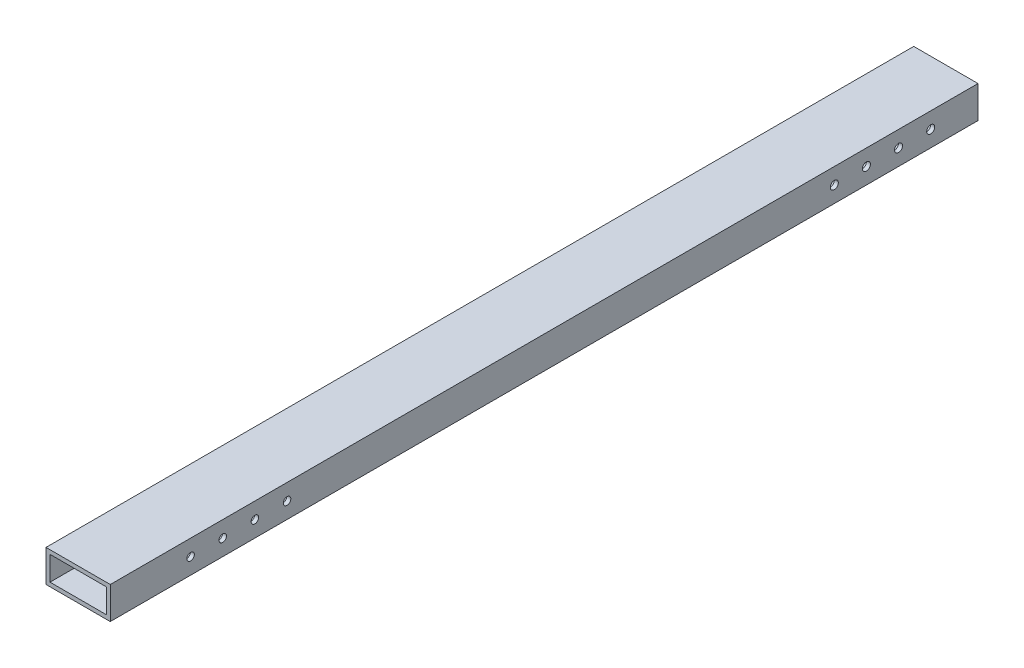
ISO-10303-21;
HEADER;
FILE_DESCRIPTION(('STEP AP214'),'2;1');
FILE_NAME('part.step','',(''),(''),'','','');
FILE_SCHEMA(('AUTOMOTIVE_DESIGN { 1 0 10303 214 1 1 1 1 }'));
ENDSEC;
DATA;
#1=APPLICATION_CONTEXT('core data for automotive mechanical design processes');
#2=APPLICATION_PROTOCOL_DEFINITION('international standard','automotive_design',2000,#1);
#3=PRODUCT_CONTEXT('',#1,'mechanical');
#4=PRODUCT('Part','Part','',(#3));
#5=PRODUCT_RELATED_PRODUCT_CATEGORY('part','',(#4));
#6=PRODUCT_DEFINITION_FORMATION('','',#4);
#7=PRODUCT_DEFINITION_CONTEXT('part definition',#1,'design');
#8=PRODUCT_DEFINITION('design','',#6,#7);
#9=PRODUCT_DEFINITION_SHAPE('','',#8);
#10=(LENGTH_UNIT() NAMED_UNIT(*) SI_UNIT(.MILLI.,.METRE.));
#11=(NAMED_UNIT(*) PLANE_ANGLE_UNIT() SI_UNIT($,.RADIAN.));
#12=(NAMED_UNIT(*) SI_UNIT($,.STERADIAN.) SOLID_ANGLE_UNIT());
#13=UNCERTAINTY_MEASURE_WITH_UNIT(LENGTH_MEASURE(1.E-05),#10,'distance_accuracy_value','');
#14=(GEOMETRIC_REPRESENTATION_CONTEXT(3) GLOBAL_UNCERTAINTY_ASSIGNED_CONTEXT((#13)) GLOBAL_UNIT_ASSIGNED_CONTEXT((#10,
#11,#12)) REPRESENTATION_CONTEXT('',''));
#15=CARTESIAN_POINT('',(0.,0.,0.));
#16=DIRECTION('',(0.,0.,1.));
#17=DIRECTION('',(1.,0.,0.));
#18=AXIS2_PLACEMENT_3D('',#15,#16,#17);
#19=CARTESIAN_POINT('',(25.4,-12.7,342.9));
#20=DIRECTION('',(-1.,0.,0.));
#21=DIRECTION('',(0.,0.,1.));
#22=AXIS2_PLACEMENT_3D('',#19,#20,#21);
#23=PLANE('',#22);
#24=CARTESIAN_POINT('',(25.4,0.,-305.51179998754));
#25=DIRECTION('',(1.,0.,0.));
#26=DIRECTION('',(0.,0.,-1.));
#27=AXIS2_PLACEMENT_3D('',#24,#25,#26);
#28=CIRCLE('',#27,3.17499999999999);
#29=CARTESIAN_POINT('',(25.4,0.,-308.68679998754));
#30=VERTEX_POINT('',#29);
#31=EDGE_CURVE('E392',#30,#30,#28,.T.);
#32=ORIENTED_EDGE('',*,*,#31,.F.);
#33=EDGE_LOOP('',(#32));
#34=FACE_BOUND('',#33,.T.);
#35=CARTESIAN_POINT('',(25.4,0.,-280.111799987541));
#36=DIRECTION('',(1.,0.,0.));
#37=DIRECTION('',(0.,0.,-1.));
#38=AXIS2_PLACEMENT_3D('',#35,#36,#37);
#39=CIRCLE('',#38,3.17499999999999);
#40=CARTESIAN_POINT('',(25.4,0.,-283.28679998754));
#41=VERTEX_POINT('',#40);
#42=EDGE_CURVE('E205',#41,#41,#39,.T.);
#43=ORIENTED_EDGE('',*,*,#42,.F.);
#44=EDGE_LOOP('',(#43));
#45=FACE_BOUND('',#44,.T.);
#46=CARTESIAN_POINT('',(25.4,0.,-254.711799987541));
#47=DIRECTION('',(1.,0.,0.));
#48=DIRECTION('',(0.,0.,-1.));
#49=AXIS2_PLACEMENT_3D('',#46,#47,#48);
#50=CIRCLE('',#49,3.17499999999999);
#51=CARTESIAN_POINT('',(25.4,0.,-257.88679998754));
#52=VERTEX_POINT('',#51);
#53=EDGE_CURVE('E202',#52,#52,#50,.T.);
#54=ORIENTED_EDGE('',*,*,#53,.F.);
#55=EDGE_LOOP('',(#54));
#56=FACE_BOUND('',#55,.T.);
#57=CARTESIAN_POINT('',(25.4,0.,-229.311799987541));
#58=DIRECTION('',(1.,0.,0.));
#59=DIRECTION('',(0.,0.,-1.));
#60=AXIS2_PLACEMENT_3D('',#57,#58,#59);
#61=CIRCLE('',#60,3.17499999999999);
#62=CARTESIAN_POINT('',(25.4,0.,-232.486799987541));
#63=VERTEX_POINT('',#62);
#64=EDGE_CURVE('E220',#63,#63,#61,.T.);
#65=ORIENTED_EDGE('',*,*,#64,.F.);
#66=EDGE_LOOP('',(#65));
#67=FACE_BOUND('',#66,.T.);
#68=CARTESIAN_POINT('',(25.4,0.,279.4));
#69=DIRECTION('',(1.,0.,0.));
#70=DIRECTION('',(0.,0.,-1.));
#71=AXIS2_PLACEMENT_3D('',#68,#69,#70);
#72=CIRCLE('',#71,2.97179999999999);
#73=CARTESIAN_POINT('',(25.4,0.,276.4282));
#74=VERTEX_POINT('',#73);
#75=EDGE_CURVE('E227',#74,#74,#72,.T.);
#76=ORIENTED_EDGE('',*,*,#75,.F.);
#77=EDGE_LOOP('',(#76));
#78=FACE_BOUND('',#77,.T.);
#79=CARTESIAN_POINT('',(25.4,0.,228.6));
#80=DIRECTION('',(1.,0.,0.));
#81=DIRECTION('',(0.,0.,-1.));
#82=AXIS2_PLACEMENT_3D('',#79,#80,#81);
#83=CIRCLE('',#82,2.97179999999999);
#84=CARTESIAN_POINT('',(25.4,0.,225.6282));
#85=VERTEX_POINT('',#84);
#86=EDGE_CURVE('E241',#85,#85,#83,.T.);
#87=ORIENTED_EDGE('',*,*,#86,.F.);
#88=EDGE_LOOP('',(#87));
#89=FACE_BOUND('',#88,.T.);
#90=CARTESIAN_POINT('',(25.4,0.,203.2));
#91=DIRECTION('',(1.,0.,0.));
#92=DIRECTION('',(0.,0.,-1.));
#93=AXIS2_PLACEMENT_3D('',#90,#91,#92);
#94=CIRCLE('',#93,2.97179999999999);
#95=CARTESIAN_POINT('',(25.4,0.,200.2282));
#96=VERTEX_POINT('',#95);
#97=EDGE_CURVE('E253',#96,#96,#94,.T.);
#98=ORIENTED_EDGE('',*,*,#97,.F.);
#99=EDGE_LOOP('',(#98));
#100=FACE_BOUND('',#99,.T.);
#101=DIRECTION('',(0.,0.,-1.));
#102=VECTOR('',#101,1.);
#103=CARTESIAN_POINT('',(25.4,-12.7,342.9));
#104=LINE('',#103,#102);
#105=CARTESIAN_POINT('',(25.4,-12.7,342.9));
#106=VERTEX_POINT('',#105);
#107=CARTESIAN_POINT('',(25.4,-12.7,-342.9));
#108=VERTEX_POINT('',#107);
#109=EDGE_CURVE('E46',#106,#108,#104,.T.);
#110=ORIENTED_EDGE('',*,*,#109,.T.);
#111=DIRECTION('',(0.,1.,0.));
#112=VECTOR('',#111,1.);
#113=CARTESIAN_POINT('',(25.4,-12.7,-342.9));
#114=LINE('',#113,#112);
#115=CARTESIAN_POINT('',(25.4,12.7,-342.9));
#116=VERTEX_POINT('',#115);
#117=EDGE_CURVE('E145',#108,#116,#114,.T.);
#118=ORIENTED_EDGE('',*,*,#117,.T.);
#119=DIRECTION('',(0.,0.,-1.));
#120=VECTOR('',#119,1.);
#121=CARTESIAN_POINT('',(25.4,12.7,342.9));
#122=LINE('',#121,#120);
#123=CARTESIAN_POINT('',(25.4,12.7,342.9));
#124=VERTEX_POINT('',#123);
#125=EDGE_CURVE('E170',#124,#116,#122,.T.);
#126=ORIENTED_EDGE('',*,*,#125,.F.);
#127=DIRECTION('',(0.,1.,0.));
#128=VECTOR('',#127,1.);
#129=CARTESIAN_POINT('',(25.4,-12.7,342.9));
#130=LINE('',#129,#128);
#131=EDGE_CURVE('E165',#106,#124,#130,.T.);
#132=ORIENTED_EDGE('',*,*,#131,.F.);
#133=EDGE_LOOP('',(#110,#118,#126,#132));
#134=FACE_BOUND('',#133,.T.);
#135=CARTESIAN_POINT('',(25.4,0.,254.));
#136=DIRECTION('',(1.,0.,0.));
#137=DIRECTION('',(0.,0.,-1.));
#138=AXIS2_PLACEMENT_3D('',#135,#136,#137);
#139=CIRCLE('',#138,2.97179999999999);
#140=CARTESIAN_POINT('',(25.4,0.,251.0282));
#141=VERTEX_POINT('',#140);
#142=EDGE_CURVE('E234',#141,#141,#139,.T.);
#143=ORIENTED_EDGE('',*,*,#142,.F.);
#144=EDGE_LOOP('',(#143));
#145=FACE_BOUND('',#144,.T.);
#146=ADVANCED_FACE('F37',(#34,#45,#56,#67,#78,#89,#100,#134,#145),#23,.F.);
#147=CARTESIAN_POINT('',(0.,0.,342.9));
#148=DIRECTION('',(0.,0.,1.));
#149=DIRECTION('',(1.,0.,0.));
#150=AXIS2_PLACEMENT_3D('',#147,#148,#149);
#151=PLANE('',#150);
#152=DIRECTION('',(0.,-1.,0.));
#153=VECTOR('',#152,1.);
#154=CARTESIAN_POINT('',(-25.4,12.7,342.9));
#155=LINE('',#154,#153);
#156=CARTESIAN_POINT('',(-25.4,12.7,342.9));
#157=VERTEX_POINT('',#156);
#158=CARTESIAN_POINT('',(-25.4,-12.7,342.9));
#159=VERTEX_POINT('',#158);
#160=EDGE_CURVE('E115',#157,#159,#155,.T.);
#161=ORIENTED_EDGE('',*,*,#160,.T.);
#162=DIRECTION('',(1.,0.,0.));
#163=VECTOR('',#162,1.);
#164=CARTESIAN_POINT('',(-25.4,-12.7,342.9));
#165=LINE('',#164,#163);
#166=EDGE_CURVE('E163',#159,#106,#165,.T.);
#167=ORIENTED_EDGE('',*,*,#166,.T.);
#168=ORIENTED_EDGE('',*,*,#131,.T.);
#169=DIRECTION('',(-1.,0.,0.));
#170=VECTOR('',#169,1.);
#171=CARTESIAN_POINT('',(25.4,12.7,342.9));
#172=LINE('',#171,#170);
#173=EDGE_CURVE('E62',#124,#157,#172,.T.);
#174=ORIENTED_EDGE('',*,*,#173,.T.);
#175=EDGE_LOOP('',(#161,#167,#168,#174));
#176=FACE_BOUND('',#175,.T.);
#177=DIRECTION('',(1.,0.,0.));
#178=VECTOR('',#177,1.);
#179=CARTESIAN_POINT('',(-22.225,-9.525,342.9));
#180=LINE('',#179,#178);
#181=CARTESIAN_POINT('',(-22.225,-9.525,342.9));
#182=VERTEX_POINT('',#181);
#183=CARTESIAN_POINT('',(22.225,-9.525,342.9));
#184=VERTEX_POINT('',#183);
#185=EDGE_CURVE('E152',#182,#184,#180,.T.);
#186=ORIENTED_EDGE('',*,*,#185,.F.);
#187=DIRECTION('',(0.,-1.,0.));
#188=VECTOR('',#187,1.);
#189=CARTESIAN_POINT('',(-22.225,9.525,342.9));
#190=LINE('',#189,#188);
#191=CARTESIAN_POINT('',(-22.225,9.525,342.9));
#192=VERTEX_POINT('',#191);
#193=EDGE_CURVE('E112',#192,#182,#190,.T.);
#194=ORIENTED_EDGE('',*,*,#193,.F.);
#195=DIRECTION('',(-1.,0.,0.));
#196=VECTOR('',#195,1.);
#197=CARTESIAN_POINT('',(22.225,9.525,342.9));
#198=LINE('',#197,#196);
#199=CARTESIAN_POINT('',(22.225,9.525,342.9));
#200=VERTEX_POINT('',#199);
#201=EDGE_CURVE('E156',#200,#192,#198,.T.);
#202=ORIENTED_EDGE('',*,*,#201,.F.);
#203=DIRECTION('',(0.,1.,0.));
#204=VECTOR('',#203,1.);
#205=CARTESIAN_POINT('',(22.225,-9.525,342.9));
#206=LINE('',#205,#204);
#207=EDGE_CURVE('E154',#184,#200,#206,.T.);
#208=ORIENTED_EDGE('',*,*,#207,.F.);
#209=EDGE_LOOP('',(#186,#194,#202,#208));
#210=FACE_BOUND('',#209,.T.);
#211=ADVANCED_FACE('F276',(#176,#210),#151,.T.);
#212=CARTESIAN_POINT('',(-25.4,12.7,342.9));
#213=DIRECTION('',(1.,0.,0.));
#214=DIRECTION('',(0.,0.,-1.));
#215=AXIS2_PLACEMENT_3D('',#212,#213,#214);
#216=PLANE('',#215);
#217=CARTESIAN_POINT('',(-25.4,0.,-305.51179998754));
#218=DIRECTION('',(1.,0.,0.));
#219=DIRECTION('',(0.,0.,-1.));
#220=AXIS2_PLACEMENT_3D('',#217,#218,#219);
#221=CIRCLE('',#220,3.17499999999999);
#222=CARTESIAN_POINT('',(-25.4,0.,-308.68679998754));
#223=VERTEX_POINT('',#222);
#224=EDGE_CURVE('E393',#223,#223,#221,.T.);
#225=ORIENTED_EDGE('',*,*,#224,.T.);
#226=EDGE_LOOP('',(#225));
#227=FACE_BOUND('',#226,.T.);
#228=CARTESIAN_POINT('',(-25.4,0.,-280.111799987541));
#229=DIRECTION('',(1.,0.,0.));
#230=DIRECTION('',(0.,0.,-1.));
#231=AXIS2_PLACEMENT_3D('',#228,#229,#230);
#232=CIRCLE('',#231,3.17499999999999);
#233=CARTESIAN_POINT('',(-25.4,0.,-283.28679998754));
#234=VERTEX_POINT('',#233);
#235=EDGE_CURVE('E198',#234,#234,#232,.T.);
#236=ORIENTED_EDGE('',*,*,#235,.T.);
#237=EDGE_LOOP('',(#236));
#238=FACE_BOUND('',#237,.T.);
#239=CARTESIAN_POINT('',(-25.4,0.,-254.711799987541));
#240=DIRECTION('',(1.,0.,0.));
#241=DIRECTION('',(0.,0.,-1.));
#242=AXIS2_PLACEMENT_3D('',#239,#240,#241);
#243=CIRCLE('',#242,3.17499999999999);
#244=CARTESIAN_POINT('',(-25.4,0.,-257.88679998754));
#245=VERTEX_POINT('',#244);
#246=EDGE_CURVE('E194',#245,#245,#243,.T.);
#247=ORIENTED_EDGE('',*,*,#246,.T.);
#248=EDGE_LOOP('',(#247));
#249=FACE_BOUND('',#248,.T.);
#250=CARTESIAN_POINT('',(-25.4,0.,-229.311799987541));
#251=DIRECTION('',(1.,0.,0.));
#252=DIRECTION('',(0.,0.,-1.));
#253=AXIS2_PLACEMENT_3D('',#250,#251,#252);
#254=CIRCLE('',#253,3.17499999999999);
#255=CARTESIAN_POINT('',(-25.4,0.,-232.486799987541));
#256=VERTEX_POINT('',#255);
#257=EDGE_CURVE('E190',#256,#256,#254,.T.);
#258=ORIENTED_EDGE('',*,*,#257,.T.);
#259=EDGE_LOOP('',(#258));
#260=FACE_BOUND('',#259,.T.);
#261=CARTESIAN_POINT('',(-25.4,0.,279.4));
#262=DIRECTION('',(1.,0.,0.));
#263=DIRECTION('',(0.,0.,-1.));
#264=AXIS2_PLACEMENT_3D('',#261,#262,#263);
#265=CIRCLE('',#264,2.97179999999999);
#266=CARTESIAN_POINT('',(-25.4,0.,276.4282));
#267=VERTEX_POINT('',#266);
#268=EDGE_CURVE('E185',#267,#267,#265,.T.);
#269=ORIENTED_EDGE('',*,*,#268,.T.);
#270=EDGE_LOOP('',(#269));
#271=FACE_BOUND('',#270,.T.);
#272=CARTESIAN_POINT('',(-25.4,0.,254.));
#273=DIRECTION('',(1.,0.,0.));
#274=DIRECTION('',(0.,0.,-1.));
#275=AXIS2_PLACEMENT_3D('',#272,#273,#274);
#276=CIRCLE('',#275,2.97179999999999);
#277=CARTESIAN_POINT('',(-25.4,0.,251.0282));
#278=VERTEX_POINT('',#277);
#279=EDGE_CURVE('E180',#278,#278,#276,.T.);
#280=ORIENTED_EDGE('',*,*,#279,.T.);
#281=EDGE_LOOP('',(#280));
#282=FACE_BOUND('',#281,.T.);
#283=CARTESIAN_POINT('',(-25.4,0.,228.6));
#284=DIRECTION('',(1.,0.,0.));
#285=DIRECTION('',(0.,0.,-1.));
#286=AXIS2_PLACEMENT_3D('',#283,#284,#285);
#287=CIRCLE('',#286,2.97179999999999);
#288=CARTESIAN_POINT('',(-25.4,0.,225.6282));
#289=VERTEX_POINT('',#288);
#290=EDGE_CURVE('E244',#289,#289,#287,.T.);
#291=ORIENTED_EDGE('',*,*,#290,.T.);
#292=EDGE_LOOP('',(#291));
#293=FACE_BOUND('',#292,.T.);
#294=CARTESIAN_POINT('',(-25.4,0.,203.2));
#295=DIRECTION('',(1.,0.,0.));
#296=DIRECTION('',(0.,0.,-1.));
#297=AXIS2_PLACEMENT_3D('',#294,#295,#296);
#298=CIRCLE('',#297,2.97179999999999);
#299=CARTESIAN_POINT('',(-25.4,0.,200.2282));
#300=VERTEX_POINT('',#299);
#301=EDGE_CURVE('E175',#300,#300,#298,.T.);
#302=ORIENTED_EDGE('',*,*,#301,.T.);
#303=EDGE_LOOP('',(#302));
#304=FACE_BOUND('',#303,.T.);
#305=DIRECTION('',(0.,0.,-1.));
#306=VECTOR('',#305,1.);
#307=CARTESIAN_POINT('',(-25.4,12.7,342.9));
#308=LINE('',#307,#306);
#309=CARTESIAN_POINT('',(-25.4,12.7,-342.9));
#310=VERTEX_POINT('',#309);
#311=EDGE_CURVE('E168',#157,#310,#308,.T.);
#312=ORIENTED_EDGE('',*,*,#311,.T.);
#313=DIRECTION('',(0.,-1.,0.));
#314=VECTOR('',#313,1.);
#315=CARTESIAN_POINT('',(-25.4,12.7,-342.9));
#316=LINE('',#315,#314);
#317=CARTESIAN_POINT('',(-25.4,-12.7,-342.9));
#318=VERTEX_POINT('',#317);
#319=EDGE_CURVE('E139',#310,#318,#316,.T.);
#320=ORIENTED_EDGE('',*,*,#319,.T.);
#321=DIRECTION('',(0.,0.,-1.));
#322=VECTOR('',#321,1.);
#323=CARTESIAN_POINT('',(-25.4,-12.7,342.9));
#324=LINE('',#323,#322);
#325=EDGE_CURVE('E11',#159,#318,#324,.T.);
#326=ORIENTED_EDGE('',*,*,#325,.F.);
#327=ORIENTED_EDGE('',*,*,#160,.F.);
#328=EDGE_LOOP('',(#312,#320,#326,#327));
#329=FACE_BOUND('',#328,.T.);
#330=ADVANCED_FACE('F39',(#227,#238,#249,#260,#271,#282,#293,#304,#329),#216,.F.);
#331=CARTESIAN_POINT('',(-25.4,-12.7,342.9));
#332=DIRECTION('',(0.,1.,0.));
#333=DIRECTION('',(-1.,0.,0.));
#334=AXIS2_PLACEMENT_3D('',#331,#332,#333);
#335=PLANE('',#334);
#336=ORIENTED_EDGE('',*,*,#325,.T.);
#337=DIRECTION('',(1.,0.,0.));
#338=VECTOR('',#337,1.);
#339=CARTESIAN_POINT('',(-25.4,-12.7,-342.9));
#340=LINE('',#339,#338);
#341=EDGE_CURVE('E142',#318,#108,#340,.T.);
#342=ORIENTED_EDGE('',*,*,#341,.T.);
#343=ORIENTED_EDGE('',*,*,#109,.F.);
#344=ORIENTED_EDGE('',*,*,#166,.F.);
#345=EDGE_LOOP('',(#336,#342,#343,#344));
#346=FACE_BOUND('',#345,.T.);
#347=ADVANCED_FACE('F287',(#346),#335,.F.);
#348=CARTESIAN_POINT('',(25.4,12.7,342.9));
#349=DIRECTION('',(0.,-1.,0.));
#350=DIRECTION('',(1.,0.,0.));
#351=AXIS2_PLACEMENT_3D('',#348,#349,#350);
#352=PLANE('',#351);
#353=ORIENTED_EDGE('',*,*,#125,.T.);
#354=DIRECTION('',(-1.,0.,0.));
#355=VECTOR('',#354,1.);
#356=CARTESIAN_POINT('',(25.4,12.7,-342.9));
#357=LINE('',#356,#355);
#358=EDGE_CURVE('E148',#116,#310,#357,.T.);
#359=ORIENTED_EDGE('',*,*,#358,.T.);
#360=ORIENTED_EDGE('',*,*,#311,.F.);
#361=ORIENTED_EDGE('',*,*,#173,.F.);
#362=EDGE_LOOP('',(#353,#359,#360,#361));
#363=FACE_BOUND('',#362,.T.);
#364=ADVANCED_FACE('F286',(#363),#352,.F.);
#365=CARTESIAN_POINT('',(-22.225,9.525,342.9));
#366=DIRECTION('',(1.,0.,0.));
#367=DIRECTION('',(0.,1.,0.));
#368=AXIS2_PLACEMENT_3D('',#365,#366,#367);
#369=PLANE('',#368);
#370=CARTESIAN_POINT('',(-22.225,0.,-305.51179998754));
#371=DIRECTION('',(1.,0.,0.));
#372=DIRECTION('',(0.,1.,0.));
#373=AXIS2_PLACEMENT_3D('',#370,#371,#372);
#374=CIRCLE('',#373,3.17499999999999);
#375=CARTESIAN_POINT('',(-22.225,3.17499999999999,-305.51179998754));
#376=VERTEX_POINT('',#375);
#377=EDGE_CURVE('E210',#376,#376,#374,.T.);
#378=ORIENTED_EDGE('',*,*,#377,.F.);
#379=EDGE_LOOP('',(#378));
#380=FACE_BOUND('',#379,.T.);
#381=CARTESIAN_POINT('',(-22.225,0.,-280.111799987541));
#382=DIRECTION('',(1.,0.,0.));
#383=DIRECTION('',(0.,1.,0.));
#384=AXIS2_PLACEMENT_3D('',#381,#382,#383);
#385=CIRCLE('',#384,3.17499999999999);
#386=CARTESIAN_POINT('',(-22.225,3.17499999999999,-280.111799987541));
#387=VERTEX_POINT('',#386);
#388=EDGE_CURVE('E197',#387,#387,#385,.T.);
#389=ORIENTED_EDGE('',*,*,#388,.F.);
#390=EDGE_LOOP('',(#389));
#391=FACE_BOUND('',#390,.T.);
#392=CARTESIAN_POINT('',(-22.225,0.,-254.711799987541));
#393=DIRECTION('',(1.,0.,0.));
#394=DIRECTION('',(0.,1.,0.));
#395=AXIS2_PLACEMENT_3D('',#392,#393,#394);
#396=CIRCLE('',#395,3.17499999999999);
#397=CARTESIAN_POINT('',(-22.225,3.17499999999999,-254.711799987541));
#398=VERTEX_POINT('',#397);
#399=EDGE_CURVE('E191',#398,#398,#396,.T.);
#400=ORIENTED_EDGE('',*,*,#399,.F.);
#401=EDGE_LOOP('',(#400));
#402=FACE_BOUND('',#401,.T.);
#403=CARTESIAN_POINT('',(-22.225,0.,-229.311799987541));
#404=DIRECTION('',(1.,0.,0.));
#405=DIRECTION('',(0.,1.,0.));
#406=AXIS2_PLACEMENT_3D('',#403,#404,#405);
#407=CIRCLE('',#406,3.17499999999999);
#408=CARTESIAN_POINT('',(-22.225,3.17499999999999,-229.311799987541));
#409=VERTEX_POINT('',#408);
#410=EDGE_CURVE('E186',#409,#409,#407,.T.);
#411=ORIENTED_EDGE('',*,*,#410,.F.);
#412=EDGE_LOOP('',(#411));
#413=FACE_BOUND('',#412,.T.);
#414=CARTESIAN_POINT('',(-22.225,0.,279.4));
#415=DIRECTION('',(1.,0.,0.));
#416=DIRECTION('',(0.,1.,0.));
#417=AXIS2_PLACEMENT_3D('',#414,#415,#416);
#418=CIRCLE('',#417,2.97179999999999);
#419=CARTESIAN_POINT('',(-22.225,2.97179999999999,279.4));
#420=VERTEX_POINT('',#419);
#421=EDGE_CURVE('E181',#420,#420,#418,.T.);
#422=ORIENTED_EDGE('',*,*,#421,.F.);
#423=EDGE_LOOP('',(#422));
#424=FACE_BOUND('',#423,.T.);
#425=CARTESIAN_POINT('',(-22.225,0.,254.));
#426=DIRECTION('',(1.,0.,0.));
#427=DIRECTION('',(0.,1.,0.));
#428=AXIS2_PLACEMENT_3D('',#425,#426,#427);
#429=CIRCLE('',#428,2.97179999999999);
#430=CARTESIAN_POINT('',(-22.225,2.97179999999999,254.));
#431=VERTEX_POINT('',#430);
#432=EDGE_CURVE('E176',#431,#431,#429,.T.);
#433=ORIENTED_EDGE('',*,*,#432,.F.);
#434=EDGE_LOOP('',(#433));
#435=FACE_BOUND('',#434,.T.);
#436=CARTESIAN_POINT('',(-22.225,0.,228.6));
#437=DIRECTION('',(1.,0.,0.));
#438=DIRECTION('',(0.,1.,0.));
#439=AXIS2_PLACEMENT_3D('',#436,#437,#438);
#440=CIRCLE('',#439,2.97179999999999);
#441=CARTESIAN_POINT('',(-22.225,2.97179999999999,228.6));
#442=VERTEX_POINT('',#441);
#443=EDGE_CURVE('E247',#442,#442,#440,.T.);
#444=ORIENTED_EDGE('',*,*,#443,.F.);
#445=EDGE_LOOP('',(#444));
#446=FACE_BOUND('',#445,.T.);
#447=CARTESIAN_POINT('',(-22.225,0.,203.2));
#448=DIRECTION('',(1.,0.,0.));
#449=DIRECTION('',(0.,1.,0.));
#450=AXIS2_PLACEMENT_3D('',#447,#448,#449);
#451=CIRCLE('',#450,2.97179999999999);
#452=CARTESIAN_POINT('',(-22.225,2.97179999999999,203.2));
#453=VERTEX_POINT('',#452);
#454=EDGE_CURVE('E130',#453,#453,#451,.T.);
#455=ORIENTED_EDGE('',*,*,#454,.F.);
#456=EDGE_LOOP('',(#455));
#457=FACE_BOUND('',#456,.T.);
#458=DIRECTION('',(0.,0.,-1.));
#459=VECTOR('',#458,1.);
#460=CARTESIAN_POINT('',(-22.225,-9.525,342.9));
#461=LINE('',#460,#459);
#462=CARTESIAN_POINT('',(-22.225,-9.525,-342.9));
#463=VERTEX_POINT('',#462);
#464=EDGE_CURVE('E104',#182,#463,#461,.T.);
#465=ORIENTED_EDGE('',*,*,#464,.T.);
#466=DIRECTION('',(0.,-1.,0.));
#467=VECTOR('',#466,1.);
#468=CARTESIAN_POINT('',(-22.225,9.525,-342.9));
#469=LINE('',#468,#467);
#470=CARTESIAN_POINT('',(-22.225,9.525,-342.9));
#471=VERTEX_POINT('',#470);
#472=EDGE_CURVE('E109',#471,#463,#469,.T.);
#473=ORIENTED_EDGE('',*,*,#472,.F.);
#474=DIRECTION('',(0.,0.,-1.));
#475=VECTOR('',#474,1.);
#476=CARTESIAN_POINT('',(-22.225,9.525,342.9));
#477=LINE('',#476,#475);
#478=EDGE_CURVE('E158',#192,#471,#477,.T.);
#479=ORIENTED_EDGE('',*,*,#478,.F.);
#480=ORIENTED_EDGE('',*,*,#193,.T.);
#481=EDGE_LOOP('',(#465,#473,#479,#480));
#482=FACE_BOUND('',#481,.T.);
#483=ADVANCED_FACE('F106',(#380,#391,#402,#413,#424,#435,#446,#457,#482),#369,.T.);
#484=CARTESIAN_POINT('',(-22.225,-9.525,342.9));
#485=DIRECTION('',(0.,1.,0.));
#486=DIRECTION('',(0.,0.,1.));
#487=AXIS2_PLACEMENT_3D('',#484,#485,#486);
#488=PLANE('',#487);
#489=DIRECTION('',(0.,0.,-1.));
#490=VECTOR('',#489,1.);
#491=CARTESIAN_POINT('',(22.225,-9.525,342.9));
#492=LINE('',#491,#490);
#493=CARTESIAN_POINT('',(22.225,-9.525,-342.9));
#494=VERTEX_POINT('',#493);
#495=EDGE_CURVE('E116',#184,#494,#492,.T.);
#496=ORIENTED_EDGE('',*,*,#495,.T.);
#497=DIRECTION('',(1.,0.,0.));
#498=VECTOR('',#497,1.);
#499=CARTESIAN_POINT('',(-22.225,-9.525,-342.9));
#500=LINE('',#499,#498);
#501=EDGE_CURVE('E119',#463,#494,#500,.T.);
#502=ORIENTED_EDGE('',*,*,#501,.F.);
#503=ORIENTED_EDGE('',*,*,#464,.F.);
#504=ORIENTED_EDGE('',*,*,#185,.T.);
#505=EDGE_LOOP('',(#496,#502,#503,#504));
#506=FACE_BOUND('',#505,.T.);
#507=ADVANCED_FACE('F120',(#506),#488,.T.);
#508=CARTESIAN_POINT('',(22.225,-9.525,342.9));
#509=DIRECTION('',(-1.,0.,0.));
#510=DIRECTION('',(0.,-1.,0.));
#511=AXIS2_PLACEMENT_3D('',#508,#509,#510);
#512=PLANE('',#511);
#513=CARTESIAN_POINT('',(22.225,0.,-305.51179998754));
#514=DIRECTION('',(-1.,0.,0.));
#515=DIRECTION('',(0.,-1.,0.));
#516=AXIS2_PLACEMENT_3D('',#513,#514,#515);
#517=CIRCLE('',#516,3.17499999999999);
#518=CARTESIAN_POINT('',(22.225,-3.17499999999999,-305.51179998754));
#519=VERTEX_POINT('',#518);
#520=EDGE_CURVE('E41',#519,#519,#517,.T.);
#521=ORIENTED_EDGE('',*,*,#520,.F.);
#522=EDGE_LOOP('',(#521));
#523=FACE_BOUND('',#522,.T.);
#524=CARTESIAN_POINT('',(22.225,0.,-280.111799987541));
#525=DIRECTION('',(-1.,0.,0.));
#526=DIRECTION('',(0.,-1.,0.));
#527=AXIS2_PLACEMENT_3D('',#524,#525,#526);
#528=CIRCLE('',#527,3.17499999999999);
#529=CARTESIAN_POINT('',(22.225,-3.17499999999999,-280.111799987541));
#530=VERTEX_POINT('',#529);
#531=EDGE_CURVE('E195',#530,#530,#528,.T.);
#532=ORIENTED_EDGE('',*,*,#531,.F.);
#533=EDGE_LOOP('',(#532));
#534=FACE_BOUND('',#533,.T.);
#535=CARTESIAN_POINT('',(22.225,0.,-254.711799987541));
#536=DIRECTION('',(-1.,0.,0.));
#537=DIRECTION('',(0.,-1.,0.));
#538=AXIS2_PLACEMENT_3D('',#535,#536,#537);
#539=CIRCLE('',#538,3.17499999999999);
#540=CARTESIAN_POINT('',(22.225,-3.17499999999999,-254.711799987541));
#541=VERTEX_POINT('',#540);
#542=EDGE_CURVE('E193',#541,#541,#539,.T.);
#543=ORIENTED_EDGE('',*,*,#542,.F.);
#544=EDGE_LOOP('',(#543));
#545=FACE_BOUND('',#544,.T.);
#546=CARTESIAN_POINT('',(22.225,0.,-229.311799987541));
#547=DIRECTION('',(-1.,0.,0.));
#548=DIRECTION('',(0.,-1.,0.));
#549=AXIS2_PLACEMENT_3D('',#546,#547,#548);
#550=CIRCLE('',#549,3.17499999999999);
#551=CARTESIAN_POINT('',(22.225,-3.17499999999999,-229.311799987541));
#552=VERTEX_POINT('',#551);
#553=EDGE_CURVE('E189',#552,#552,#550,.T.);
#554=ORIENTED_EDGE('',*,*,#553,.F.);
#555=EDGE_LOOP('',(#554));
#556=FACE_BOUND('',#555,.T.);
#557=CARTESIAN_POINT('',(22.225,0.,279.4));
#558=DIRECTION('',(-1.,0.,0.));
#559=DIRECTION('',(0.,-1.,0.));
#560=AXIS2_PLACEMENT_3D('',#557,#558,#559);
#561=CIRCLE('',#560,2.97179999999999);
#562=CARTESIAN_POINT('',(22.225,-2.97179999999999,279.4));
#563=VERTEX_POINT('',#562);
#564=EDGE_CURVE('E184',#563,#563,#561,.T.);
#565=ORIENTED_EDGE('',*,*,#564,.F.);
#566=EDGE_LOOP('',(#565));
#567=FACE_BOUND('',#566,.T.);
#568=CARTESIAN_POINT('',(22.225,0.,254.));
#569=DIRECTION('',(-1.,0.,0.));
#570=DIRECTION('',(0.,-1.,0.));
#571=AXIS2_PLACEMENT_3D('',#568,#569,#570);
#572=CIRCLE('',#571,2.97179999999999);
#573=CARTESIAN_POINT('',(22.225,-2.97179999999999,254.));
#574=VERTEX_POINT('',#573);
#575=EDGE_CURVE('E179',#574,#574,#572,.T.);
#576=ORIENTED_EDGE('',*,*,#575,.F.);
#577=EDGE_LOOP('',(#576));
#578=FACE_BOUND('',#577,.T.);
#579=CARTESIAN_POINT('',(22.225,0.,228.6));
#580=DIRECTION('',(-1.,0.,0.));
#581=DIRECTION('',(0.,-1.,0.));
#582=AXIS2_PLACEMENT_3D('',#579,#580,#581);
#583=CIRCLE('',#582,2.97179999999999);
#584=CARTESIAN_POINT('',(22.225,-2.97179999999999,228.6));
#585=VERTEX_POINT('',#584);
#586=EDGE_CURVE('E250',#585,#585,#583,.T.);
#587=ORIENTED_EDGE('',*,*,#586,.F.);
#588=EDGE_LOOP('',(#587));
#589=FACE_BOUND('',#588,.T.);
#590=CARTESIAN_POINT('',(22.225,0.,203.2));
#591=DIRECTION('',(-1.,0.,0.));
#592=DIRECTION('',(0.,-1.,0.));
#593=AXIS2_PLACEMENT_3D('',#590,#591,#592);
#594=CIRCLE('',#593,2.97179999999999);
#595=CARTESIAN_POINT('',(22.225,-2.97179999999999,203.2));
#596=VERTEX_POINT('',#595);
#597=EDGE_CURVE('E133',#596,#596,#594,.T.);
#598=ORIENTED_EDGE('',*,*,#597,.F.);
#599=EDGE_LOOP('',(#598));
#600=FACE_BOUND('',#599,.T.);
#601=DIRECTION('',(0.,0.,-1.));
#602=VECTOR('',#601,1.);
#603=CARTESIAN_POINT('',(22.225,9.525,342.9));
#604=LINE('',#603,#602);
#605=CARTESIAN_POINT('',(22.225,9.525,-342.9));
#606=VERTEX_POINT('',#605);
#607=EDGE_CURVE('E54',#200,#606,#604,.T.);
#608=ORIENTED_EDGE('',*,*,#607,.T.);
#609=DIRECTION('',(0.,1.,0.));
#610=VECTOR('',#609,1.);
#611=CARTESIAN_POINT('',(22.225,-9.525,-342.9));
#612=LINE('',#611,#610);
#613=EDGE_CURVE('E125',#494,#606,#612,.T.);
#614=ORIENTED_EDGE('',*,*,#613,.F.);
#615=ORIENTED_EDGE('',*,*,#495,.F.);
#616=ORIENTED_EDGE('',*,*,#207,.T.);
#617=EDGE_LOOP('',(#608,#614,#615,#616));
#618=FACE_BOUND('',#617,.T.);
#619=ADVANCED_FACE('F311',(#523,#534,#545,#556,#567,#578,#589,#600,#618),#512,.T.);
#620=CARTESIAN_POINT('',(22.225,9.525,342.9));
#621=DIRECTION('',(0.,-1.,0.));
#622=DIRECTION('',(0.,0.,-1.));
#623=AXIS2_PLACEMENT_3D('',#620,#621,#622);
#624=PLANE('',#623);
#625=ORIENTED_EDGE('',*,*,#478,.T.);
#626=DIRECTION('',(-1.,0.,0.));
#627=VECTOR('',#626,1.);
#628=CARTESIAN_POINT('',(22.225,9.525,-342.9));
#629=LINE('',#628,#627);
#630=EDGE_CURVE('E129',#606,#471,#629,.T.);
#631=ORIENTED_EDGE('',*,*,#630,.F.);
#632=ORIENTED_EDGE('',*,*,#607,.F.);
#633=ORIENTED_EDGE('',*,*,#201,.T.);
#634=EDGE_LOOP('',(#625,#631,#632,#633));
#635=FACE_BOUND('',#634,.T.);
#636=ADVANCED_FACE('F312',(#635),#624,.T.);
#637=CARTESIAN_POINT('',(0.,0.,-342.9));
#638=DIRECTION('',(0.,0.,1.));
#639=DIRECTION('',(1.,0.,0.));
#640=AXIS2_PLACEMENT_3D('',#637,#638,#639);
#641=PLANE('',#640);
#642=ORIENTED_EDGE('',*,*,#630,.T.);
#643=ORIENTED_EDGE('',*,*,#472,.T.);
#644=ORIENTED_EDGE('',*,*,#501,.T.);
#645=ORIENTED_EDGE('',*,*,#613,.T.);
#646=EDGE_LOOP('',(#642,#643,#644,#645));
#647=FACE_BOUND('',#646,.T.);
#648=ORIENTED_EDGE('',*,*,#319,.F.);
#649=ORIENTED_EDGE('',*,*,#358,.F.);
#650=ORIENTED_EDGE('',*,*,#117,.F.);
#651=ORIENTED_EDGE('',*,*,#341,.F.);
#652=EDGE_LOOP('',(#648,#649,#650,#651));
#653=FACE_BOUND('',#652,.T.);
#654=ADVANCED_FACE('F127',(#647,#653),#641,.F.);
#655=CARTESIAN_POINT('',(25.4,0.,203.2));
#656=DIRECTION('',(1.,0.,0.));
#657=DIRECTION('',(0.,0.,-1.));
#658=AXIS2_PLACEMENT_3D('',#655,#656,#657);
#659=CYLINDRICAL_SURFACE('',#658,2.97179999999999);
#660=ORIENTED_EDGE('',*,*,#597,.T.);
#661=EDGE_LOOP('',(#660));
#662=FACE_BOUND('',#661,.T.);
#663=ORIENTED_EDGE('',*,*,#97,.T.);
#664=EDGE_LOOP('',(#663));
#665=FACE_BOUND('',#664,.T.);
#666=ADVANCED_FACE('F263',(#662,#665),#659,.F.);
#667=ORIENTED_EDGE('',*,*,#454,.T.);
#668=EDGE_LOOP('',(#667));
#669=FACE_BOUND('',#668,.T.);
#670=ORIENTED_EDGE('',*,*,#301,.F.);
#671=EDGE_LOOP('',(#670));
#672=FACE_BOUND('',#671,.T.);
#673=ADVANCED_FACE('F260',(#669,#672),#659,.F.);
#674=CARTESIAN_POINT('',(25.4,0.,228.6));
#675=DIRECTION('',(1.,0.,0.));
#676=DIRECTION('',(0.,0.,-1.));
#677=AXIS2_PLACEMENT_3D('',#674,#675,#676);
#678=CYLINDRICAL_SURFACE('',#677,2.97179999999999);
#679=ORIENTED_EDGE('',*,*,#586,.T.);
#680=EDGE_LOOP('',(#679));
#681=FACE_BOUND('',#680,.T.);
#682=ORIENTED_EDGE('',*,*,#86,.T.);
#683=EDGE_LOOP('',(#682));
#684=FACE_BOUND('',#683,.T.);
#685=ADVANCED_FACE('F262',(#681,#684),#678,.F.);
#686=ORIENTED_EDGE('',*,*,#443,.T.);
#687=EDGE_LOOP('',(#686));
#688=FACE_BOUND('',#687,.T.);
#689=ORIENTED_EDGE('',*,*,#290,.F.);
#690=EDGE_LOOP('',(#689));
#691=FACE_BOUND('',#690,.T.);
#692=ADVANCED_FACE('F270',(#688,#691),#678,.F.);
#693=CARTESIAN_POINT('',(25.4,0.,254.));
#694=DIRECTION('',(1.,0.,0.));
#695=DIRECTION('',(0.,0.,-1.));
#696=AXIS2_PLACEMENT_3D('',#693,#694,#695);
#697=CYLINDRICAL_SURFACE('',#696,2.97179999999999);
#698=ORIENTED_EDGE('',*,*,#575,.T.);
#699=EDGE_LOOP('',(#698));
#700=FACE_BOUND('',#699,.T.);
#701=ORIENTED_EDGE('',*,*,#142,.T.);
#702=EDGE_LOOP('',(#701));
#703=FACE_BOUND('',#702,.T.);
#704=ADVANCED_FACE('F347',(#700,#703),#697,.F.);
#705=ORIENTED_EDGE('',*,*,#432,.T.);
#706=EDGE_LOOP('',(#705));
#707=FACE_BOUND('',#706,.T.);
#708=ORIENTED_EDGE('',*,*,#279,.F.);
#709=EDGE_LOOP('',(#708));
#710=FACE_BOUND('',#709,.T.);
#711=ADVANCED_FACE('F353',(#707,#710),#697,.F.);
#712=CARTESIAN_POINT('',(25.4,0.,279.4));
#713=DIRECTION('',(1.,0.,0.));
#714=DIRECTION('',(0.,0.,-1.));
#715=AXIS2_PLACEMENT_3D('',#712,#713,#714);
#716=CYLINDRICAL_SURFACE('',#715,2.97179999999999);
#717=ORIENTED_EDGE('',*,*,#421,.T.);
#718=EDGE_LOOP('',(#717));
#719=FACE_BOUND('',#718,.T.);
#720=ORIENTED_EDGE('',*,*,#268,.F.);
#721=EDGE_LOOP('',(#720));
#722=FACE_BOUND('',#721,.T.);
#723=ADVANCED_FACE('F358',(#719,#722),#716,.F.);
#724=ORIENTED_EDGE('',*,*,#564,.T.);
#725=EDGE_LOOP('',(#724));
#726=FACE_BOUND('',#725,.T.);
#727=ORIENTED_EDGE('',*,*,#75,.T.);
#728=EDGE_LOOP('',(#727));
#729=FACE_BOUND('',#728,.T.);
#730=ADVANCED_FACE('F362',(#726,#729),#716,.F.);
#731=CARTESIAN_POINT('',(25.4,0.,-229.311799987541));
#732=DIRECTION('',(1.,0.,0.));
#733=DIRECTION('',(0.,0.,-1.));
#734=AXIS2_PLACEMENT_3D('',#731,#732,#733);
#735=CYLINDRICAL_SURFACE('',#734,3.17499999999999);
#736=ORIENTED_EDGE('',*,*,#410,.T.);
#737=EDGE_LOOP('',(#736));
#738=FACE_BOUND('',#737,.T.);
#739=ORIENTED_EDGE('',*,*,#257,.F.);
#740=EDGE_LOOP('',(#739));
#741=FACE_BOUND('',#740,.T.);
#742=ADVANCED_FACE('F364',(#738,#741),#735,.F.);
#743=ORIENTED_EDGE('',*,*,#553,.T.);
#744=EDGE_LOOP('',(#743));
#745=FACE_BOUND('',#744,.T.);
#746=ORIENTED_EDGE('',*,*,#64,.T.);
#747=EDGE_LOOP('',(#746));
#748=FACE_BOUND('',#747,.T.);
#749=ADVANCED_FACE('F367',(#745,#748),#735,.F.);
#750=CARTESIAN_POINT('',(25.4,0.,-254.711799987541));
#751=DIRECTION('',(1.,0.,0.));
#752=DIRECTION('',(0.,0.,-1.));
#753=AXIS2_PLACEMENT_3D('',#750,#751,#752);
#754=CYLINDRICAL_SURFACE('',#753,3.17499999999999);
#755=ORIENTED_EDGE('',*,*,#399,.T.);
#756=EDGE_LOOP('',(#755));
#757=FACE_BOUND('',#756,.T.);
#758=ORIENTED_EDGE('',*,*,#246,.F.);
#759=EDGE_LOOP('',(#758));
#760=FACE_BOUND('',#759,.T.);
#761=ADVANCED_FACE('F369',(#757,#760),#754,.F.);
#762=ORIENTED_EDGE('',*,*,#542,.T.);
#763=EDGE_LOOP('',(#762));
#764=FACE_BOUND('',#763,.T.);
#765=ORIENTED_EDGE('',*,*,#53,.T.);
#766=EDGE_LOOP('',(#765));
#767=FACE_BOUND('',#766,.T.);
#768=ADVANCED_FACE('F372',(#764,#767),#754,.F.);
#769=CARTESIAN_POINT('',(25.4,0.,-280.111799987541));
#770=DIRECTION('',(1.,0.,0.));
#771=DIRECTION('',(0.,0.,-1.));
#772=AXIS2_PLACEMENT_3D('',#769,#770,#771);
#773=CYLINDRICAL_SURFACE('',#772,3.17499999999999);
#774=ORIENTED_EDGE('',*,*,#531,.T.);
#775=EDGE_LOOP('',(#774));
#776=FACE_BOUND('',#775,.T.);
#777=ORIENTED_EDGE('',*,*,#42,.T.);
#778=EDGE_LOOP('',(#777));
#779=FACE_BOUND('',#778,.T.);
#780=ADVANCED_FACE('F374',(#776,#779),#773,.F.);
#781=ORIENTED_EDGE('',*,*,#388,.T.);
#782=EDGE_LOOP('',(#781));
#783=FACE_BOUND('',#782,.T.);
#784=ORIENTED_EDGE('',*,*,#235,.F.);
#785=EDGE_LOOP('',(#784));
#786=FACE_BOUND('',#785,.T.);
#787=ADVANCED_FACE('F377',(#783,#786),#773,.F.);
#788=CARTESIAN_POINT('',(25.4,0.,-305.51179998754));
#789=DIRECTION('',(1.,0.,0.));
#790=DIRECTION('',(0.,0.,-1.));
#791=AXIS2_PLACEMENT_3D('',#788,#789,#790);
#792=CYLINDRICAL_SURFACE('',#791,3.17499999999999);
#793=ORIENTED_EDGE('',*,*,#520,.T.);
#794=EDGE_LOOP('',(#793));
#795=FACE_BOUND('',#794,.T.);
#796=ORIENTED_EDGE('',*,*,#31,.T.);
#797=EDGE_LOOP('',(#796));
#798=FACE_BOUND('',#797,.T.);
#799=ADVANCED_FACE('F378',(#795,#798),#792,.F.);
#800=ORIENTED_EDGE('',*,*,#377,.T.);
#801=EDGE_LOOP('',(#800));
#802=FACE_BOUND('',#801,.T.);
#803=ORIENTED_EDGE('',*,*,#224,.F.);
#804=EDGE_LOOP('',(#803));
#805=FACE_BOUND('',#804,.T.);
#806=ADVANCED_FACE('F380',(#802,#805),#792,.F.);
#807=CLOSED_SHELL('',(#146,#211,#330,#347,#364,#483,#507,#619,#636,#654,#666,#673,#685,#692,
#704,#711,#723,#730,#742,#749,#761,#768,#780,#787,#799,#806));
#808=MANIFOLD_SOLID_BREP('B2',#807);
#809=ADVANCED_BREP_SHAPE_REPRESENTATION('',(#18,#808),#14);
#810=SHAPE_DEFINITION_REPRESENTATION(#9,#809);
ENDSEC;
END-ISO-10303-21;
